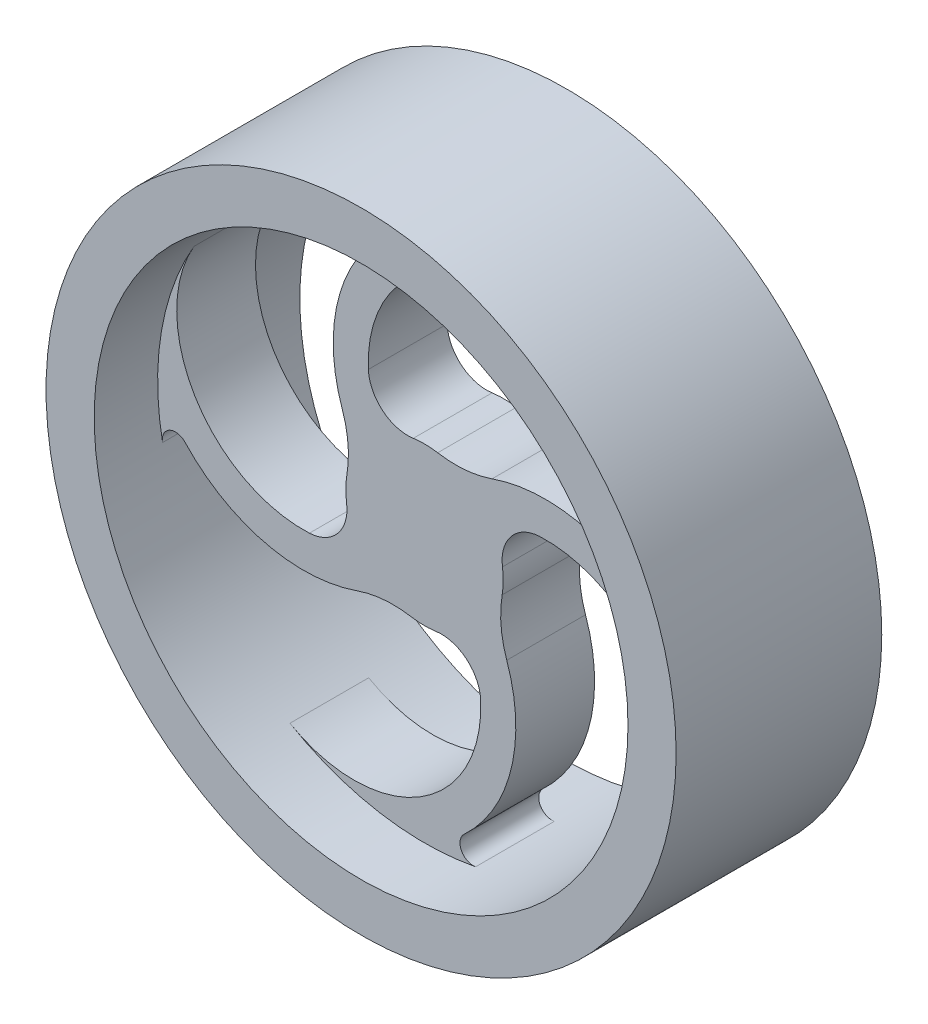
ISO-10303-21;
HEADER;
FILE_DESCRIPTION(('STEP AP214'),'2;1');
FILE_NAME('part.step','',(''),(''),'','','');
FILE_SCHEMA(('AUTOMOTIVE_DESIGN { 1 0 10303 214 1 1 1 1 }'));
ENDSEC;
DATA;
#1=APPLICATION_CONTEXT('core data for automotive mechanical design processes');
#2=APPLICATION_PROTOCOL_DEFINITION('international standard','automotive_design',2000,#1);
#3=PRODUCT_CONTEXT('',#1,'mechanical');
#4=PRODUCT('Part','Part','',(#3));
#5=PRODUCT_RELATED_PRODUCT_CATEGORY('part','',(#4));
#6=PRODUCT_DEFINITION_FORMATION('','',#4);
#7=PRODUCT_DEFINITION_CONTEXT('part definition',#1,'design');
#8=PRODUCT_DEFINITION('design','',#6,#7);
#9=PRODUCT_DEFINITION_SHAPE('','',#8);
#10=(LENGTH_UNIT() NAMED_UNIT(*) SI_UNIT(.MILLI.,.METRE.));
#11=(NAMED_UNIT(*) PLANE_ANGLE_UNIT() SI_UNIT($,.RADIAN.));
#12=(NAMED_UNIT(*) SI_UNIT($,.STERADIAN.) SOLID_ANGLE_UNIT());
#13=UNCERTAINTY_MEASURE_WITH_UNIT(LENGTH_MEASURE(1.E-05),#10,'distance_accuracy_value','');
#14=(GEOMETRIC_REPRESENTATION_CONTEXT(3) GLOBAL_UNCERTAINTY_ASSIGNED_CONTEXT((#13)) GLOBAL_UNIT_ASSIGNED_CONTEXT((#10,
#11,#12)) REPRESENTATION_CONTEXT('',''));
#15=CARTESIAN_POINT('',(0.,0.,0.));
#16=DIRECTION('',(0.,0.,1.));
#17=DIRECTION('',(1.,0.,0.));
#18=AXIS2_PLACEMENT_3D('',#15,#16,#17);
#19=CARTESIAN_POINT('',(16.134984535512,27.6344382970497,-18.));
#20=DIRECTION('',(0.,0.,1.));
#21=DIRECTION('',(1.,0.,0.));
#22=AXIS2_PLACEMENT_3D('',#19,#20,#21);
#23=CYLINDRICAL_SURFACE('',#22,29.0000014694584);
#24=CARTESIAN_POINT('',(16.134984535512,27.6344382970497,0.));
#25=DIRECTION('',(0.,0.,1.));
#26=DIRECTION('',(1.,0.,0.));
#27=AXIS2_PLACEMENT_3D('',#24,#25,#26);
#28=CIRCLE('',#27,29.0000014694584);
#29=CARTESIAN_POINT('',(30.7573156832135,52.678150422762,0.));
#30=VERTEX_POINT('',#29);
#31=CARTESIAN_POINT('',(-12.8350143326064,26.3156317116074,0.));
#32=VERTEX_POINT('',#31);
#33=EDGE_CURVE('E247',#30,#32,#28,.T.);
#34=ORIENTED_EDGE('',*,*,#33,.T.);
#35=DIRECTION('',(0.,0.,1.));
#36=VECTOR('',#35,1.);
#37=CARTESIAN_POINT('',(-12.8350143326064,26.3156317116074,-18.));
#38=LINE('',#37,#36);
#39=CARTESIAN_POINT('',(-12.8350143326064,26.3156317116074,-18.));
#40=VERTEX_POINT('',#39);
#41=EDGE_CURVE('E11',#40,#32,#38,.T.);
#42=ORIENTED_EDGE('',*,*,#41,.F.);
#43=CARTESIAN_POINT('',(16.134984535512,27.6344382970497,-18.));
#44=DIRECTION('',(0.,0.,1.));
#45=DIRECTION('',(1.,0.,0.));
#46=AXIS2_PLACEMENT_3D('',#43,#44,#45);
#47=CIRCLE('',#46,29.0000014694584);
#48=CARTESIAN_POINT('',(30.7573156832135,52.678150422762,-18.));
#49=VERTEX_POINT('',#48);
#50=EDGE_CURVE('E353',#49,#40,#47,.T.);
#51=ORIENTED_EDGE('',*,*,#50,.F.);
#52=DIRECTION('',(0.,0.,1.));
#53=VECTOR('',#52,1.);
#54=CARTESIAN_POINT('',(30.7573152957529,52.6781506489895,-18.));
#55=LINE('',#54,#53);
#56=EDGE_CURVE('E246',#49,#30,#55,.T.);
#57=ORIENTED_EDGE('',*,*,#56,.T.);
#58=EDGE_LOOP('',(#34,#42,#51,#57));
#59=FACE_BOUND('',#58,.T.);
#60=ADVANCED_FACE('F43',(#59),#23,.F.);
#61=CARTESIAN_POINT('',(-3.84432548427402,26.7249164932472,-18.));
#62=DIRECTION('',(0.,0.,1.));
#63=DIRECTION('',(1.,0.,0.));
#64=AXIS2_PLACEMENT_3D('',#61,#62,#63);
#65=CYLINDRICAL_SURFACE('',#64,9.00000000000062);
#66=CARTESIAN_POINT('',(-3.84432548427402,26.7249164932472,0.));
#67=DIRECTION('',(0.,0.,1.));
#68=DIRECTION('',(1.,0.,0.));
#69=AXIS2_PLACEMENT_3D('',#66,#67,#68);
#70=CIRCLE('',#69,9.00000000000062);
#71=CARTESIAN_POINT('',(-2.56288325265867,17.8166110535441,0.));
#72=VERTEX_POINT('',#71);
#73=EDGE_CURVE('E251',#32,#72,#70,.T.);
#74=ORIENTED_EDGE('',*,*,#73,.T.);
#75=DIRECTION('',(0.,0.,1.));
#76=VECTOR('',#75,1.);
#77=CARTESIAN_POINT('',(-2.56288325265867,17.8166110535441,-18.));
#78=LINE('',#77,#76);
#79=CARTESIAN_POINT('',(-2.56288325265867,17.8166110535441,-18.));
#80=VERTEX_POINT('',#79);
#81=EDGE_CURVE('E52',#80,#72,#78,.T.);
#82=ORIENTED_EDGE('',*,*,#81,.F.);
#83=CARTESIAN_POINT('',(-3.84432548427402,26.7249164932472,-18.));
#84=DIRECTION('',(0.,0.,1.));
#85=DIRECTION('',(1.,0.,0.));
#86=AXIS2_PLACEMENT_3D('',#83,#84,#85);
#87=CIRCLE('',#86,9.00000000000062);
#88=EDGE_CURVE('E150',#40,#80,#87,.T.);
#89=ORIENTED_EDGE('',*,*,#88,.F.);
#90=ORIENTED_EDGE('',*,*,#41,.T.);
#91=EDGE_LOOP('',(#74,#82,#89,#90));
#92=FACE_BOUND('',#91,.T.);
#93=ADVANCED_FACE('F437',(#92),#65,.F.);
#94=CARTESIAN_POINT('',(0.,0.,-18.));
#95=DIRECTION('',(0.,0.,1.));
#96=DIRECTION('',(1.,0.,0.));
#97=AXIS2_PLACEMENT_3D('',#94,#95,#96);
#98=CYLINDRICAL_SURFACE('',#97,18.0000000000008);
#99=CARTESIAN_POINT('',(0.,0.,0.));
#100=DIRECTION('',(0.,0.,1.));
#101=DIRECTION('',(1.,0.,0.));
#102=AXIS2_PLACEMENT_3D('',#99,#100,#101);
#103=CIRCLE('',#102,18.0000000000008);
#104=CARTESIAN_POINT('',(3.00763509896575,17.7469470927114,0.));
#105=VERTEX_POINT('',#104);
#106=EDGE_CURVE('E256',#105,#72,#103,.T.);
#107=ORIENTED_EDGE('',*,*,#106,.F.);
#108=DIRECTION('',(0.,0.,1.));
#109=VECTOR('',#108,1.);
#110=CARTESIAN_POINT('',(3.00763509896575,17.7469470927114,-18.));
#111=LINE('',#110,#109);
#112=CARTESIAN_POINT('',(3.00763509896575,17.7469470927114,-18.));
#113=VERTEX_POINT('',#112);
#114=EDGE_CURVE('E428',#113,#105,#111,.T.);
#115=ORIENTED_EDGE('',*,*,#114,.F.);
#116=CARTESIAN_POINT('',(0.,0.,-18.));
#117=DIRECTION('',(0.,0.,1.));
#118=DIRECTION('',(1.,0.,0.));
#119=AXIS2_PLACEMENT_3D('',#116,#117,#118);
#120=CIRCLE('',#119,18.0000000000008);
#121=EDGE_CURVE('E436',#113,#80,#120,.T.);
#122=ORIENTED_EDGE('',*,*,#121,.T.);
#123=ORIENTED_EDGE('',*,*,#81,.T.);
#124=EDGE_LOOP('',(#107,#115,#122,#123));
#125=FACE_BOUND('',#124,.T.);
#126=ADVANCED_FACE('F434',(#125),#98,.T.);
#127=CARTESIAN_POINT('',(7.18490606913064,42.3954847215827,-18.));
#128=DIRECTION('',(0.,0.,1.));
#129=DIRECTION('',(1.,0.,0.));
#130=AXIS2_PLACEMENT_3D('',#127,#128,#129);
#131=CYLINDRICAL_SURFACE('',#130,25.0000000000013);
#132=CARTESIAN_POINT('',(7.18490606913064,42.3954847215827,0.));
#133=DIRECTION('',(0.,0.,1.));
#134=DIRECTION('',(1.,0.,0.));
#135=AXIS2_PLACEMENT_3D('',#132,#133,#134);
#136=CIRCLE('',#135,25.0000000000013);
#137=CARTESIAN_POINT('',(15.4306840332518,18.7944858917348,0.));
#138=VERTEX_POINT('',#137);
#139=EDGE_CURVE('E260',#105,#138,#136,.T.);
#140=ORIENTED_EDGE('',*,*,#139,.T.);
#141=DIRECTION('',(0.,0.,1.));
#142=VECTOR('',#141,1.);
#143=CARTESIAN_POINT('',(15.4306840332518,18.7944858917348,-18.));
#144=LINE('',#143,#142);
#145=CARTESIAN_POINT('',(15.4306840332518,18.7944858917348,-18.));
#146=VERTEX_POINT('',#145);
#147=EDGE_CURVE('E425',#146,#138,#144,.T.);
#148=ORIENTED_EDGE('',*,*,#147,.F.);
#149=CARTESIAN_POINT('',(7.18490606913064,42.3954847215827,-18.));
#150=DIRECTION('',(0.,0.,1.));
#151=DIRECTION('',(1.,0.,0.));
#152=AXIS2_PLACEMENT_3D('',#149,#150,#151);
#153=CIRCLE('',#152,25.0000000000013);
#154=EDGE_CURVE('E450',#113,#146,#153,.T.);
#155=ORIENTED_EDGE('',*,*,#154,.F.);
#156=ORIENTED_EDGE('',*,*,#114,.T.);
#157=EDGE_LOOP('',(#140,#148,#155,#156));
#158=FACE_BOUND('',#157,.T.);
#159=ADVANCED_FACE('F447',(#158),#131,.F.);
#160=CARTESIAN_POINT('',(27.63443542015,-16.134992376437,-18.));
#161=DIRECTION('',(0.,0.,1.));
#162=DIRECTION('',(1.,0.,0.));
#163=AXIS2_PLACEMENT_3D('',#160,#161,#162);
#164=CYLINDRICAL_SURFACE('',#163,36.9999999999987);
#165=CARTESIAN_POINT('',(27.63443542015,-16.134992376437,0.));
#166=DIRECTION('',(0.,0.,1.));
#167=DIRECTION('',(1.,0.,0.));
#168=AXIS2_PLACEMENT_3D('',#165,#166,#167);
#169=CIRCLE('',#168,36.9999999999987);
#170=CARTESIAN_POINT('',(54.7303126593143,9.06051191778274,0.));
#171=VERTEX_POINT('',#170);
#172=EDGE_CURVE('E264',#171,#138,#169,.T.);
#173=ORIENTED_EDGE('',*,*,#172,.F.);
#174=DIRECTION('',(0.,0.,1.));
#175=VECTOR('',#174,1.);
#176=CARTESIAN_POINT('',(54.7303126593143,9.06051191778274,-18.));
#177=LINE('',#176,#175);
#178=CARTESIAN_POINT('',(54.7303126593143,9.06051191778274,-18.));
#179=VERTEX_POINT('',#178);
#180=EDGE_CURVE('E422',#179,#171,#177,.T.);
#181=ORIENTED_EDGE('',*,*,#180,.F.);
#182=CARTESIAN_POINT('',(27.63443542015,-16.134992376437,-18.));
#183=DIRECTION('',(0.,0.,1.));
#184=DIRECTION('',(1.,0.,0.));
#185=AXIS2_PLACEMENT_3D('',#182,#183,#184);
#186=CIRCLE('',#185,36.9999999999987);
#187=EDGE_CURVE('E453',#179,#146,#186,.T.);
#188=ORIENTED_EDGE('',*,*,#187,.T.);
#189=ORIENTED_EDGE('',*,*,#147,.T.);
#190=EDGE_LOOP('',(#173,#181,#188,#189));
#191=FACE_BOUND('',#190,.T.);
#192=ADVANCED_FACE('F593',(#191),#164,.T.);
#193=CARTESIAN_POINT('',(56.9272756787052,11.1033906443404,-18.));
#194=DIRECTION('',(0.,0.,1.));
#195=DIRECTION('',(1.,0.,0.));
#196=AXIS2_PLACEMENT_3D('',#193,#194,#195);
#197=CYLINDRICAL_SURFACE('',#196,2.99999999999882);
#198=CARTESIAN_POINT('',(56.9272756787052,11.1033906443404,0.));
#199=DIRECTION('',(0.,0.,1.));
#200=DIRECTION('',(1.,0.,0.));
#201=AXIS2_PLACEMENT_3D('',#198,#199,#200);
#202=CIRCLE('',#201,2.99999999999882);
#203=CARTESIAN_POINT('',(59.8717899379474,11.6777039535302,0.));
#204=VERTEX_POINT('',#203);
#205=EDGE_CURVE('E268',#171,#204,#202,.T.);
#206=ORIENTED_EDGE('',*,*,#205,.T.);
#207=DIRECTION('',(0.,0.,1.));
#208=VECTOR('',#207,1.);
#209=CARTESIAN_POINT('',(59.8717899379474,11.6777039535302,-18.));
#210=LINE('',#209,#208);
#211=CARTESIAN_POINT('',(59.8717899379474,11.6777039535301,-18.));
#212=VERTEX_POINT('',#211);
#213=EDGE_CURVE('E419',#212,#204,#210,.T.);
#214=ORIENTED_EDGE('',*,*,#213,.F.);
#215=CARTESIAN_POINT('',(56.9272756787052,11.1033906443404,-18.));
#216=DIRECTION('',(0.,0.,1.));
#217=DIRECTION('',(1.,0.,0.));
#218=AXIS2_PLACEMENT_3D('',#215,#216,#217);
#219=CIRCLE('',#218,2.99999999999882);
#220=EDGE_CURVE('E463',#179,#212,#219,.T.);
#221=ORIENTED_EDGE('',*,*,#220,.F.);
#222=ORIENTED_EDGE('',*,*,#180,.T.);
#223=EDGE_LOOP('',(#206,#214,#221,#222));
#224=FACE_BOUND('',#223,.T.);
#225=ADVANCED_FACE('F596',(#224),#197,.F.);
#226=CARTESIAN_POINT('',(27.63443542015,-16.134992376437,-18.));
#227=DIRECTION('',(0.,0.,1.));
#228=DIRECTION('',(1.,0.,0.));
#229=AXIS2_PLACEMENT_3D('',#226,#227,#228);
#230=CYLINDRICAL_SURFACE('',#229,29.0000000003419);
#231=CARTESIAN_POINT('',(27.63443542015,-16.134992376437,0.));
#232=DIRECTION('',(0.,0.,1.));
#233=DIRECTION('',(1.,0.,0.));
#234=AXIS2_PLACEMENT_3D('',#231,#232,#233);
#235=CIRCLE('',#234,29.0000000003419);
#236=CARTESIAN_POINT('',(52.6781425202238,-30.7573292179116,0.));
#237=VERTEX_POINT('',#236);
#238=CARTESIAN_POINT('',(26.315634878569,12.8350052961787,0.));
#239=VERTEX_POINT('',#238);
#240=EDGE_CURVE('E276',#237,#239,#235,.T.);
#241=ORIENTED_EDGE('',*,*,#240,.T.);
#242=DIRECTION('',(0.,0.,1.));
#243=VECTOR('',#242,1.);
#244=CARTESIAN_POINT('',(26.315634878569,12.8350052961787,-18.));
#245=LINE('',#244,#243);
#246=CARTESIAN_POINT('',(26.315634878569,12.8350052961787,-18.));
#247=VERTEX_POINT('',#246);
#248=EDGE_CURVE('E411',#247,#239,#245,.T.);
#249=ORIENTED_EDGE('',*,*,#248,.F.);
#250=CARTESIAN_POINT('',(27.63443542015,-16.134992376437,-18.));
#251=DIRECTION('',(0.,0.,1.));
#252=DIRECTION('',(1.,0.,0.));
#253=AXIS2_PLACEMENT_3D('',#250,#251,#252);
#254=CIRCLE('',#253,29.0000000003419);
#255=CARTESIAN_POINT('',(52.6781425202238,-30.7573292179116,-18.));
#256=VERTEX_POINT('',#255);
#257=EDGE_CURVE('E471',#256,#247,#254,.T.);
#258=ORIENTED_EDGE('',*,*,#257,.F.);
#259=DIRECTION('',(0.,0.,1.));
#260=VECTOR('',#259,1.);
#261=CARTESIAN_POINT('',(52.6781425202229,-30.757329217911,-18.));
#262=LINE('',#261,#260);
#263=EDGE_CURVE('E415',#256,#237,#262,.T.);
#264=ORIENTED_EDGE('',*,*,#263,.T.);
#265=EDGE_LOOP('',(#241,#249,#258,#264));
#266=FACE_BOUND('',#265,.T.);
#267=ADVANCED_FACE('F600',(#266),#230,.F.);
#268=CARTESIAN_POINT('',(26.7249178052616,3.84431636340755,-18.));
#269=DIRECTION('',(0.,0.,1.));
#270=DIRECTION('',(1.,0.,0.));
#271=AXIS2_PLACEMENT_3D('',#268,#269,#270);
#272=CYLINDRICAL_SURFACE('',#271,8.99999999999842);
#273=CARTESIAN_POINT('',(26.7249178052616,3.84431636340755,0.));
#274=DIRECTION('',(0.,0.,1.));
#275=DIRECTION('',(1.,0.,0.));
#276=AXIS2_PLACEMENT_3D('',#273,#274,#275);
#277=CIRCLE('',#276,8.99999999999842);
#278=CARTESIAN_POINT('',(17.8166117047979,2.56287872527853,0.));
#279=VERTEX_POINT('',#278);
#280=EDGE_CURVE('E279',#239,#279,#277,.T.);
#281=ORIENTED_EDGE('',*,*,#280,.T.);
#282=DIRECTION('',(0.,0.,1.));
#283=VECTOR('',#282,1.);
#284=CARTESIAN_POINT('',(17.8166117047979,2.56287872527853,-18.));
#285=LINE('',#284,#283);
#286=CARTESIAN_POINT('',(17.8166117047979,2.56287872527853,-18.));
#287=VERTEX_POINT('',#286);
#288=EDGE_CURVE('E408',#287,#279,#285,.T.);
#289=ORIENTED_EDGE('',*,*,#288,.F.);
#290=CARTESIAN_POINT('',(26.7249178052616,3.84431636340755,-18.));
#291=DIRECTION('',(0.,0.,1.));
#292=DIRECTION('',(1.,0.,0.));
#293=AXIS2_PLACEMENT_3D('',#290,#291,#292);
#294=CIRCLE('',#293,8.99999999999842);
#295=EDGE_CURVE('E474',#247,#287,#294,.T.);
#296=ORIENTED_EDGE('',*,*,#295,.F.);
#297=ORIENTED_EDGE('',*,*,#248,.T.);
#298=EDGE_LOOP('',(#281,#289,#296,#297));
#299=FACE_BOUND('',#298,.T.);
#300=ADVANCED_FACE('F604',(#299),#272,.F.);
#301=CARTESIAN_POINT('',(0.,0.,-18.));
#302=DIRECTION('',(0.,0.,1.));
#303=DIRECTION('',(1.,0.,0.));
#304=AXIS2_PLACEMENT_3D('',#301,#302,#303);
#305=CYLINDRICAL_SURFACE('',#304,18.0000000000008);
#306=CARTESIAN_POINT('',(0.,0.,0.));
#307=DIRECTION('',(0.,0.,1.));
#308=DIRECTION('',(1.,0.,0.));
#309=AXIS2_PLACEMENT_3D('',#306,#307,#308);
#310=CIRCLE('',#309,18.0000000000008);
#311=CARTESIAN_POINT('',(17.7469469927022,-3.00763568908295,0.));
#312=VERTEX_POINT('',#311);
#313=EDGE_CURVE('E283',#312,#279,#310,.T.);
#314=ORIENTED_EDGE('',*,*,#313,.F.);
#315=DIRECTION('',(0.,0.,1.));
#316=VECTOR('',#315,1.);
#317=CARTESIAN_POINT('',(17.7469469927022,-3.00763568908295,-18.));
#318=LINE('',#317,#316);
#319=CARTESIAN_POINT('',(17.7469469927022,-3.00763568908295,-18.));
#320=VERTEX_POINT('',#319);
#321=EDGE_CURVE('E405',#320,#312,#318,.T.);
#322=ORIENTED_EDGE('',*,*,#321,.F.);
#323=CARTESIAN_POINT('',(0.,0.,-18.));
#324=DIRECTION('',(0.,0.,1.));
#325=DIRECTION('',(1.,0.,0.));
#326=AXIS2_PLACEMENT_3D('',#323,#324,#325);
#327=CIRCLE('',#326,18.0000000000008);
#328=EDGE_CURVE('E477',#320,#287,#327,.T.);
#329=ORIENTED_EDGE('',*,*,#328,.T.);
#330=ORIENTED_EDGE('',*,*,#288,.T.);
#331=EDGE_LOOP('',(#314,#322,#329,#330));
#332=FACE_BOUND('',#331,.T.);
#333=ADVANCED_FACE('F608',(#332),#305,.T.);
#334=CARTESIAN_POINT('',(42.3954846214234,-7.18490666011555,-18.));
#335=DIRECTION('',(0.,0.,1.));
#336=DIRECTION('',(1.,0.,0.));
#337=AXIS2_PLACEMENT_3D('',#334,#335,#336);
#338=CYLINDRICAL_SURFACE('',#337,24.9999999999983);
#339=CARTESIAN_POINT('',(42.3954846214234,-7.18490666011555,0.));
#340=DIRECTION('',(0.,0.,1.));
#341=DIRECTION('',(1.,0.,0.));
#342=AXIS2_PLACEMENT_3D('',#339,#340,#341);
#343=CIRCLE('',#342,24.9999999999983);
#344=CARTESIAN_POINT('',(18.7944863497258,-15.4306862217604,0.));
#345=VERTEX_POINT('',#344);
#346=EDGE_CURVE('E287',#312,#345,#343,.T.);
#347=ORIENTED_EDGE('',*,*,#346,.T.);
#348=DIRECTION('',(0.,0.,1.));
#349=VECTOR('',#348,1.);
#350=CARTESIAN_POINT('',(18.7944863497258,-15.4306862217604,-18.));
#351=LINE('',#350,#349);
#352=CARTESIAN_POINT('',(18.7944863497258,-15.4306862217604,-18.));
#353=VERTEX_POINT('',#352);
#354=EDGE_CURVE('E402',#353,#345,#351,.T.);
#355=ORIENTED_EDGE('',*,*,#354,.F.);
#356=CARTESIAN_POINT('',(42.3954846214234,-7.18490666011555,-18.));
#357=DIRECTION('',(0.,0.,1.));
#358=DIRECTION('',(1.,0.,0.));
#359=AXIS2_PLACEMENT_3D('',#356,#357,#358);
#360=CIRCLE('',#359,24.9999999999983);
#361=EDGE_CURVE('E481',#320,#353,#360,.T.);
#362=ORIENTED_EDGE('',*,*,#361,.F.);
#363=ORIENTED_EDGE('',*,*,#321,.T.);
#364=EDGE_LOOP('',(#347,#355,#362,#363));
#365=FACE_BOUND('',#364,.T.);
#366=ADVANCED_FACE('F612',(#365),#338,.F.);
#367=CARTESIAN_POINT('',(-16.1349849997751,-27.634437844345,-18.));
#368=DIRECTION('',(0.,0.,1.));
#369=DIRECTION('',(1.,0.,0.));
#370=AXIS2_PLACEMENT_3D('',#367,#368,#369);
#371=CYLINDRICAL_SURFACE('',#370,36.9999935462333);
#372=CARTESIAN_POINT('',(-16.1349849997751,-27.634437844345,0.));
#373=DIRECTION('',(0.,0.,1.));
#374=DIRECTION('',(1.,0.,0.));
#375=AXIS2_PLACEMENT_3D('',#372,#373,#374);
#376=CIRCLE('',#375,36.9999935462333);
#377=CARTESIAN_POINT('',(9.0605127339962,-54.7303123710849,0.));
#378=VERTEX_POINT('',#377);
#379=EDGE_CURVE('E291',#378,#345,#376,.T.);
#380=ORIENTED_EDGE('',*,*,#379,.F.);
#381=DIRECTION('',(0.,0.,1.));
#382=VECTOR('',#381,1.);
#383=CARTESIAN_POINT('',(9.0605127339962,-54.7303123710849,-18.));
#384=LINE('',#383,#382);
#385=CARTESIAN_POINT('',(9.0605127339962,-54.7303123710849,-18.));
#386=VERTEX_POINT('',#385);
#387=EDGE_CURVE('E399',#386,#378,#384,.T.);
#388=ORIENTED_EDGE('',*,*,#387,.F.);
#389=CARTESIAN_POINT('',(-16.1349849997751,-27.634437844345,-18.));
#390=DIRECTION('',(0.,0.,1.));
#391=DIRECTION('',(1.,0.,0.));
#392=AXIS2_PLACEMENT_3D('',#389,#390,#391);
#393=CIRCLE('',#392,36.9999935462333);
#394=EDGE_CURVE('E484',#386,#353,#393,.T.);
#395=ORIENTED_EDGE('',*,*,#394,.T.);
#396=ORIENTED_EDGE('',*,*,#354,.T.);
#397=EDGE_LOOP('',(#380,#388,#395,#396));
#398=FACE_BOUND('',#397,.T.);
#399=ADVANCED_FACE('F616',(#398),#371,.T.);
#400=CARTESIAN_POINT('',(11.1033912849575,-56.9272755537578,-18.));
#401=DIRECTION('',(0.,0.,1.));
#402=DIRECTION('',(1.,0.,0.));
#403=AXIS2_PLACEMENT_3D('',#400,#401,#402);
#404=CYLINDRICAL_SURFACE('',#403,2.99999999999856);
#405=CARTESIAN_POINT('',(11.1033912849575,-56.9272755537578,0.));
#406=DIRECTION('',(0.,0.,1.));
#407=DIRECTION('',(1.,0.,0.));
#408=AXIS2_PLACEMENT_3D('',#405,#406,#407);
#409=CIRCLE('',#408,2.99999999999856);
#410=CARTESIAN_POINT('',(11.6777046272832,-59.8717898065367,0.));
#411=VERTEX_POINT('',#410);
#412=EDGE_CURVE('E295',#378,#411,#409,.T.);
#413=ORIENTED_EDGE('',*,*,#412,.T.);
#414=DIRECTION('',(0.,0.,1.));
#415=VECTOR('',#414,1.);
#416=CARTESIAN_POINT('',(11.6777046272832,-59.8717898065367,-18.));
#417=LINE('',#416,#415);
#418=CARTESIAN_POINT('',(11.6777046272826,-59.8717898065368,-18.));
#419=VERTEX_POINT('',#418);
#420=EDGE_CURVE('E396',#419,#411,#417,.T.);
#421=ORIENTED_EDGE('',*,*,#420,.F.);
#422=CARTESIAN_POINT('',(11.1033912849575,-56.9272755537578,-18.));
#423=DIRECTION('',(0.,0.,1.));
#424=DIRECTION('',(1.,0.,0.));
#425=AXIS2_PLACEMENT_3D('',#422,#423,#424);
#426=CIRCLE('',#425,2.99999999999856);
#427=EDGE_CURVE('E488',#386,#419,#426,.T.);
#428=ORIENTED_EDGE('',*,*,#427,.F.);
#429=ORIENTED_EDGE('',*,*,#387,.T.);
#430=EDGE_LOOP('',(#413,#421,#428,#429));
#431=FACE_BOUND('',#430,.T.);
#432=ADVANCED_FACE('F620',(#431),#404,.F.);
#433=CARTESIAN_POINT('',(-16.1349849997751,-27.634437844345,-18.));
#434=DIRECTION('',(0.,0.,1.));
#435=DIRECTION('',(1.,0.,0.));
#436=AXIS2_PLACEMENT_3D('',#433,#434,#435);
#437=CYLINDRICAL_SURFACE('',#436,29.0000016263136);
#438=CARTESIAN_POINT('',(-16.1349849997751,-27.634437844345,0.));
#439=DIRECTION('',(0.,0.,1.));
#440=DIRECTION('',(1.,0.,0.));
#441=AXIS2_PLACEMENT_3D('',#438,#439,#440);
#442=CIRCLE('',#441,29.0000016263136);
#443=CARTESIAN_POINT('',(-30.7573167189789,-52.6781498180074,0.));
#444=VERTEX_POINT('',#443);
#445=CARTESIAN_POINT('',(12.8350140580935,-26.3156319779325,0.));
#446=VERTEX_POINT('',#445);
#447=EDGE_CURVE('E303',#444,#446,#442,.T.);
#448=ORIENTED_EDGE('',*,*,#447,.T.);
#449=DIRECTION('',(0.,0.,1.));
#450=VECTOR('',#449,1.);
#451=CARTESIAN_POINT('',(12.8350140580935,-26.3156319779325,-18.));
#452=LINE('',#451,#450);
#453=CARTESIAN_POINT('',(12.8350140580935,-26.3156319779325,-18.));
#454=VERTEX_POINT('',#453);
#455=EDGE_CURVE('E388',#454,#446,#452,.T.);
#456=ORIENTED_EDGE('',*,*,#455,.F.);
#457=CARTESIAN_POINT('',(-16.1349849997751,-27.634437844345,-18.));
#458=DIRECTION('',(0.,0.,1.));
#459=DIRECTION('',(1.,0.,0.));
#460=AXIS2_PLACEMENT_3D('',#457,#458,#459);
#461=CIRCLE('',#460,29.0000016263136);
#462=CARTESIAN_POINT('',(-30.7573167189789,-52.6781498180074,-18.));
#463=VERTEX_POINT('',#462);
#464=EDGE_CURVE('E496',#463,#454,#461,.T.);
#465=ORIENTED_EDGE('',*,*,#464,.F.);
#466=DIRECTION('',(0.,0.,1.));
#467=VECTOR('',#466,1.);
#468=CARTESIAN_POINT('',(-30.7573167189783,-52.6781498180063,-18.));
#469=LINE('',#468,#467);
#470=EDGE_CURVE('E392',#463,#444,#469,.T.);
#471=ORIENTED_EDGE('',*,*,#470,.T.);
#472=EDGE_LOOP('',(#448,#456,#465,#471));
#473=FACE_BOUND('',#472,.T.);
#474=ADVANCED_FACE('F624',(#473),#437,.F.);
#475=CARTESIAN_POINT('',(3.84432519950451,-26.7249165342103,-18.));
#476=DIRECTION('',(0.,0.,1.));
#477=DIRECTION('',(1.,0.,0.));
#478=AXIS2_PLACEMENT_3D('',#475,#476,#477);
#479=CYLINDRICAL_SURFACE('',#478,9.0000000000004);
#480=CARTESIAN_POINT('',(3.84432519950451,-26.7249165342103,0.));
#481=DIRECTION('',(0.,0.,1.));
#482=DIRECTION('',(1.,0.,0.));
#483=AXIS2_PLACEMENT_3D('',#480,#481,#482);
#484=CIRCLE('',#483,9.0000000000004);
#485=CARTESIAN_POINT('',(2.56288204912299,-17.8166112266702,0.));
#486=VERTEX_POINT('',#485);
#487=EDGE_CURVE('E306',#446,#486,#484,.T.);
#488=ORIENTED_EDGE('',*,*,#487,.T.);
#489=DIRECTION('',(0.,0.,1.));
#490=VECTOR('',#489,1.);
#491=CARTESIAN_POINT('',(2.56288204912299,-17.8166112266702,-18.));
#492=LINE('',#491,#490);
#493=CARTESIAN_POINT('',(2.56288204912299,-17.8166112266702,-18.));
#494=VERTEX_POINT('',#493);
#495=EDGE_CURVE('E385',#494,#486,#492,.T.);
#496=ORIENTED_EDGE('',*,*,#495,.F.);
#497=CARTESIAN_POINT('',(3.84432519950451,-26.7249165342103,-18.));
#498=DIRECTION('',(0.,0.,1.));
#499=DIRECTION('',(1.,0.,0.));
#500=AXIS2_PLACEMENT_3D('',#497,#498,#499);
#501=CIRCLE('',#500,9.0000000000004);
#502=EDGE_CURVE('E499',#454,#494,#501,.T.);
#503=ORIENTED_EDGE('',*,*,#502,.F.);
#504=ORIENTED_EDGE('',*,*,#455,.T.);
#505=EDGE_LOOP('',(#488,#496,#503,#504));
#506=FACE_BOUND('',#505,.T.);
#507=ADVANCED_FACE('F628',(#506),#479,.F.);
#508=CARTESIAN_POINT('',(0.,0.,-18.));
#509=DIRECTION('',(0.,0.,1.));
#510=DIRECTION('',(1.,0.,0.));
#511=AXIS2_PLACEMENT_3D('',#508,#509,#510);
#512=CYLINDRICAL_SURFACE('',#511,18.0000000000008);
#513=CARTESIAN_POINT('',(0.,0.,0.));
#514=DIRECTION('',(0.,0.,1.));
#515=DIRECTION('',(1.,0.,0.));
#516=AXIS2_PLACEMENT_3D('',#513,#514,#515);
#517=CIRCLE('',#516,18.0000000000008);
#518=CARTESIAN_POINT('',(-3.00763494607107,-17.746947118623,0.));
#519=VERTEX_POINT('',#518);
#520=EDGE_CURVE('E310',#519,#486,#517,.T.);
#521=ORIENTED_EDGE('',*,*,#520,.F.);
#522=DIRECTION('',(0.,0.,1.));
#523=VECTOR('',#522,1.);
#524=CARTESIAN_POINT('',(-3.00763494607107,-17.746947118623,-18.));
#525=LINE('',#524,#523);
#526=CARTESIAN_POINT('',(-3.00763494607107,-17.746947118623,-18.));
#527=VERTEX_POINT('',#526);
#528=EDGE_CURVE('E382',#527,#519,#525,.T.);
#529=ORIENTED_EDGE('',*,*,#528,.F.);
#530=CARTESIAN_POINT('',(0.,0.,-18.));
#531=DIRECTION('',(0.,0.,1.));
#532=DIRECTION('',(1.,0.,0.));
#533=AXIS2_PLACEMENT_3D('',#530,#531,#532);
#534=CIRCLE('',#533,18.0000000000008);
#535=EDGE_CURVE('E502',#527,#494,#534,.T.);
#536=ORIENTED_EDGE('',*,*,#535,.T.);
#537=ORIENTED_EDGE('',*,*,#495,.T.);
#538=EDGE_LOOP('',(#521,#529,#536,#537));
#539=FACE_BOUND('',#538,.T.);
#540=ADVANCED_FACE('F632',(#539),#512,.T.);
#541=CARTESIAN_POINT('',(-7.18490591710366,-42.3954847473456,-18.));
#542=DIRECTION('',(0.,0.,1.));
#543=DIRECTION('',(1.,0.,0.));
#544=AXIS2_PLACEMENT_3D('',#541,#542,#543);
#545=CYLINDRICAL_SURFACE('',#544,24.9999999999998);
#546=CARTESIAN_POINT('',(-7.18490591710366,-42.3954847473456,0.));
#547=DIRECTION('',(0.,0.,1.));
#548=DIRECTION('',(1.,0.,0.));
#549=AXIS2_PLACEMENT_3D('',#546,#547,#548);
#550=CIRCLE('',#549,24.9999999999998);
#551=CARTESIAN_POINT('',(-15.4306855256056,-18.7944864920175,0.));
#552=VERTEX_POINT('',#551);
#553=EDGE_CURVE('E314',#519,#552,#550,.T.);
#554=ORIENTED_EDGE('',*,*,#553,.T.);
#555=DIRECTION('',(0.,0.,1.));
#556=VECTOR('',#555,1.);
#557=CARTESIAN_POINT('',(-15.4306855256056,-18.7944864920175,-18.));
#558=LINE('',#557,#556);
#559=CARTESIAN_POINT('',(-15.4306855256056,-18.7944864920175,-18.));
#560=VERTEX_POINT('',#559);
#561=EDGE_CURVE('E379',#560,#552,#558,.T.);
#562=ORIENTED_EDGE('',*,*,#561,.F.);
#563=CARTESIAN_POINT('',(-7.18490591710366,-42.3954847473456,-18.));
#564=DIRECTION('',(0.,0.,1.));
#565=DIRECTION('',(1.,0.,0.));
#566=AXIS2_PLACEMENT_3D('',#563,#564,#565);
#567=CIRCLE('',#566,24.9999999999998);
#568=EDGE_CURVE('E506',#527,#560,#567,.T.);
#569=ORIENTED_EDGE('',*,*,#568,.F.);
#570=ORIENTED_EDGE('',*,*,#528,.T.);
#571=EDGE_LOOP('',(#554,#562,#569,#570));
#572=FACE_BOUND('',#571,.T.);
#573=ADVANCED_FACE('F636',(#572),#545,.F.);
#574=CARTESIAN_POINT('',(-27.634437217535,16.1349848332547,-18.));
#575=DIRECTION('',(0.,0.,1.));
#576=DIRECTION('',(1.,0.,0.));
#577=AXIS2_PLACEMENT_3D('',#574,#575,#576);
#578=CYLINDRICAL_SURFACE('',#577,36.999993546233);
#579=CARTESIAN_POINT('',(-27.634437217535,16.1349848332547,0.));
#580=DIRECTION('',(0.,0.,1.));
#581=DIRECTION('',(1.,0.,0.));
#582=AXIS2_PLACEMENT_3D('',#579,#580,#581);
#583=CIRCLE('',#582,36.999993546233);
#584=CARTESIAN_POINT('',(-54.7303124399533,-9.06051215236601,0.));
#585=VERTEX_POINT('',#584);
#586=EDGE_CURVE('E318',#585,#552,#583,.T.);
#587=ORIENTED_EDGE('',*,*,#586,.F.);
#588=DIRECTION('',(0.,0.,1.));
#589=VECTOR('',#588,1.);
#590=CARTESIAN_POINT('',(-54.7303124399533,-9.06051215236601,-18.));
#591=LINE('',#590,#589);
#592=CARTESIAN_POINT('',(-54.7303124399533,-9.06051215236601,-18.));
#593=VERTEX_POINT('',#592);
#594=EDGE_CURVE('E376',#593,#585,#591,.T.);
#595=ORIENTED_EDGE('',*,*,#594,.F.);
#596=CARTESIAN_POINT('',(-27.634437217535,16.1349848332547,-18.));
#597=DIRECTION('',(0.,0.,1.));
#598=DIRECTION('',(1.,0.,0.));
#599=AXIS2_PLACEMENT_3D('',#596,#597,#598);
#600=CIRCLE('',#599,36.999993546233);
#601=EDGE_CURVE('E509',#593,#560,#600,.T.);
#602=ORIENTED_EDGE('',*,*,#601,.T.);
#603=ORIENTED_EDGE('',*,*,#561,.T.);
#604=EDGE_LOOP('',(#587,#595,#602,#603));
#605=FACE_BOUND('',#604,.T.);
#606=ADVANCED_FACE('F640',(#605),#578,.T.);
#607=CARTESIAN_POINT('',(-56.9272756790319,-11.1033906426658,-18.));
#608=DIRECTION('',(0.,0.,1.));
#609=DIRECTION('',(1.,0.,0.));
#610=AXIS2_PLACEMENT_3D('',#607,#608,#609);
#611=CYLINDRICAL_SURFACE('',#610,2.99999999999874);
#612=CARTESIAN_POINT('',(-56.9272756790319,-11.1033906426658,0.));
#613=DIRECTION('',(0.,0.,1.));
#614=DIRECTION('',(1.,0.,0.));
#615=AXIS2_PLACEMENT_3D('',#612,#613,#614);
#616=CIRCLE('',#615,2.99999999999874);
#617=CARTESIAN_POINT('',(-59.8717899382909,-11.677703951769,0.));
#618=VERTEX_POINT('',#617);
#619=EDGE_CURVE('E322',#585,#618,#616,.T.);
#620=ORIENTED_EDGE('',*,*,#619,.T.);
#621=DIRECTION('',(0.,0.,1.));
#622=VECTOR('',#621,1.);
#623=CARTESIAN_POINT('',(-59.8717899382909,-11.677703951769,-18.));
#624=LINE('',#623,#622);
#625=CARTESIAN_POINT('',(-59.8717899382909,-11.677703951769,-18.));
#626=VERTEX_POINT('',#625);
#627=EDGE_CURVE('E373',#626,#618,#624,.T.);
#628=ORIENTED_EDGE('',*,*,#627,.F.);
#629=CARTESIAN_POINT('',(-56.9272756790319,-11.1033906426658,-18.));
#630=DIRECTION('',(0.,0.,1.));
#631=DIRECTION('',(1.,0.,0.));
#632=AXIS2_PLACEMENT_3D('',#629,#630,#631);
#633=CIRCLE('',#632,2.99999999999874);
#634=EDGE_CURVE('E513',#593,#626,#633,.T.);
#635=ORIENTED_EDGE('',*,*,#634,.F.);
#636=ORIENTED_EDGE('',*,*,#594,.T.);
#637=EDGE_LOOP('',(#620,#628,#635,#636));
#638=FACE_BOUND('',#637,.T.);
#639=ADVANCED_FACE('F644',(#638),#611,.F.);
#640=CARTESIAN_POINT('',(-27.634437217535,16.1349848332547,-18.));
#641=DIRECTION('',(0.,0.,1.));
#642=DIRECTION('',(1.,0.,0.));
#643=AXIS2_PLACEMENT_3D('',#640,#641,#642);
#644=CYLINDRICAL_SURFACE('',#643,29.0000022515743);
#645=CARTESIAN_POINT('',(-27.634437217535,16.1349848332547,0.));
#646=DIRECTION('',(0.,0.,1.));
#647=DIRECTION('',(1.,0.,0.));
#648=AXIS2_PLACEMENT_3D('',#645,#646,#647);
#649=CIRCLE('',#648,29.0000022515743);
#650=CARTESIAN_POINT('',(-52.6781496524502,30.7573170025289,0.));
#651=VERTEX_POINT('',#650);
#652=CARTESIAN_POINT('',(-26.3156321026672,-12.8350148847348,0.));
#653=VERTEX_POINT('',#652);
#654=EDGE_CURVE('E330',#651,#653,#649,.T.);
#655=ORIENTED_EDGE('',*,*,#654,.T.);
#656=DIRECTION('',(0.,0.,1.));
#657=VECTOR('',#656,1.);
#658=CARTESIAN_POINT('',(-26.3156321026672,-12.8350148847348,-18.));
#659=LINE('',#658,#657);
#660=CARTESIAN_POINT('',(-26.3156321026672,-12.8350148847348,-18.));
#661=VERTEX_POINT('',#660);
#662=EDGE_CURVE('E365',#661,#653,#659,.T.);
#663=ORIENTED_EDGE('',*,*,#662,.F.);
#664=CARTESIAN_POINT('',(-27.634437217535,16.1349848332547,-18.));
#665=DIRECTION('',(0.,0.,1.));
#666=DIRECTION('',(1.,0.,0.));
#667=AXIS2_PLACEMENT_3D('',#664,#665,#666);
#668=CIRCLE('',#667,29.0000022515743);
#669=CARTESIAN_POINT('',(-52.6781496524502,30.7573170025289,-18.));
#670=VERTEX_POINT('',#669);
#671=EDGE_CURVE('E233',#670,#661,#668,.T.);
#672=ORIENTED_EDGE('',*,*,#671,.F.);
#673=DIRECTION('',(0.,0.,1.));
#674=VECTOR('',#673,1.);
#675=CARTESIAN_POINT('',(-52.6781496524502,30.7573170025289,-18.));
#676=LINE('',#675,#674);
#677=EDGE_CURVE('E369',#670,#651,#676,.T.);
#678=ORIENTED_EDGE('',*,*,#677,.T.);
#679=EDGE_LOOP('',(#655,#663,#672,#678));
#680=FACE_BOUND('',#679,.T.);
#681=ADVANCED_FACE('F526',(#680),#644,.F.);
#682=CARTESIAN_POINT('',(-26.7249164168836,-3.84432601512492,-18.));
#683=DIRECTION('',(0.,0.,1.));
#684=DIRECTION('',(1.,0.,0.));
#685=AXIS2_PLACEMENT_3D('',#682,#683,#684);
#686=CYLINDRICAL_SURFACE('',#685,8.99999999999948);
#687=CARTESIAN_POINT('',(-26.7249164168836,-3.84432601512492,0.));
#688=DIRECTION('',(0.,0.,1.));
#689=DIRECTION('',(1.,0.,0.));
#690=AXIS2_PLACEMENT_3D('',#687,#688,#689);
#691=CIRCLE('',#690,8.99999999999948);
#692=CARTESIAN_POINT('',(-17.8166113271796,-2.5628813504027,0.));
#693=VERTEX_POINT('',#692);
#694=EDGE_CURVE('E333',#653,#693,#691,.T.);
#695=ORIENTED_EDGE('',*,*,#694,.T.);
#696=DIRECTION('',(0.,0.,1.));
#697=VECTOR('',#696,1.);
#698=CARTESIAN_POINT('',(-17.8166113271796,-2.5628813504027,-18.));
#699=LINE('',#698,#697);
#700=CARTESIAN_POINT('',(-17.8166113271796,-2.5628813504027,-18.));
#701=VERTEX_POINT('',#700);
#702=EDGE_CURVE('E215',#701,#693,#699,.T.);
#703=ORIENTED_EDGE('',*,*,#702,.F.);
#704=CARTESIAN_POINT('',(-26.7249164168836,-3.84432601512492,-18.));
#705=DIRECTION('',(0.,0.,1.));
#706=DIRECTION('',(1.,0.,0.));
#707=AXIS2_PLACEMENT_3D('',#704,#705,#706);
#708=CIRCLE('',#707,8.99999999999948);
#709=EDGE_CURVE('E228',#661,#701,#708,.T.);
#710=ORIENTED_EDGE('',*,*,#709,.F.);
#711=ORIENTED_EDGE('',*,*,#662,.T.);
#712=EDGE_LOOP('',(#695,#703,#710,#711));
#713=FACE_BOUND('',#712,.T.);
#714=ADVANCED_FACE('F530',(#713),#686,.F.);
#715=CARTESIAN_POINT('',(0.,0.,-18.));
#716=DIRECTION('',(0.,0.,1.));
#717=DIRECTION('',(1.,0.,0.));
#718=AXIS2_PLACEMENT_3D('',#715,#716,#717);
#719=CYLINDRICAL_SURFACE('',#718,18.0000000000008);
#720=CARTESIAN_POINT('',(0.,0.,0.));
#721=DIRECTION('',(0.,0.,1.));
#722=DIRECTION('',(1.,0.,0.));
#723=AXIS2_PLACEMENT_3D('',#720,#721,#722);
#724=CIRCLE('',#723,18.0000000000008);
#725=CARTESIAN_POINT('',(-17.7469470926813,3.00763509914331,0.));
#726=VERTEX_POINT('',#725);
#727=EDGE_CURVE('E210',#726,#693,#724,.T.);
#728=ORIENTED_EDGE('',*,*,#727,.F.);
#729=DIRECTION('',(0.,0.,1.));
#730=VECTOR('',#729,1.);
#731=CARTESIAN_POINT('',(-17.7469470926813,3.00763509914331,-18.));
#732=LINE('',#731,#730);
#733=CARTESIAN_POINT('',(-17.7469470926813,3.00763509914331,-18.));
#734=VERTEX_POINT('',#733);
#735=EDGE_CURVE('E204',#734,#726,#732,.T.);
#736=ORIENTED_EDGE('',*,*,#735,.F.);
#737=CARTESIAN_POINT('',(0.,0.,-18.));
#738=DIRECTION('',(0.,0.,1.));
#739=DIRECTION('',(1.,0.,0.));
#740=AXIS2_PLACEMENT_3D('',#737,#738,#739);
#741=CIRCLE('',#740,18.0000000000008);
#742=EDGE_CURVE('E208',#734,#701,#741,.T.);
#743=ORIENTED_EDGE('',*,*,#742,.T.);
#744=ORIENTED_EDGE('',*,*,#702,.T.);
#745=EDGE_LOOP('',(#728,#736,#743,#744));
#746=FACE_BOUND('',#745,.T.);
#747=ADVANCED_FACE('F206',(#746),#719,.T.);
#748=CARTESIAN_POINT('',(-42.3954847214037,7.18490607017591,-18.));
#749=DIRECTION('',(0.,0.,1.));
#750=DIRECTION('',(1.,0.,0.));
#751=AXIS2_PLACEMENT_3D('',#748,#749,#750);
#752=CYLINDRICAL_SURFACE('',#751,24.9999999999996);
#753=CARTESIAN_POINT('',(-42.3954847214037,7.18490607017591,0.));
#754=DIRECTION('',(0.,0.,1.));
#755=DIRECTION('',(1.,0.,0.));
#756=AXIS2_PLACEMENT_3D('',#753,#754,#755);
#757=CIRCLE('',#756,24.9999999999996);
#758=CARTESIAN_POINT('',(-18.7944865965932,15.4306860522435,0.));
#759=VERTEX_POINT('',#758);
#760=EDGE_CURVE('E339',#726,#759,#757,.T.);
#761=ORIENTED_EDGE('',*,*,#760,.T.);
#762=DIRECTION('',(0.,0.,1.));
#763=VECTOR('',#762,1.);
#764=CARTESIAN_POINT('',(-18.7944865965932,15.4306860522435,-18.));
#765=LINE('',#764,#763);
#766=CARTESIAN_POINT('',(-18.7944865965932,15.4306860522435,-18.));
#767=VERTEX_POINT('',#766);
#768=EDGE_CURVE('E216',#767,#759,#765,.T.);
#769=ORIENTED_EDGE('',*,*,#768,.F.);
#770=CARTESIAN_POINT('',(-42.3954847214037,7.18490607017591,-18.));
#771=DIRECTION('',(0.,0.,1.));
#772=DIRECTION('',(1.,0.,0.));
#773=AXIS2_PLACEMENT_3D('',#770,#771,#772);
#774=CIRCLE('',#773,24.9999999999996);
#775=EDGE_CURVE('E219',#734,#767,#774,.T.);
#776=ORIENTED_EDGE('',*,*,#775,.F.);
#777=ORIENTED_EDGE('',*,*,#735,.T.);
#778=EDGE_LOOP('',(#761,#769,#776,#777));
#779=FACE_BOUND('',#778,.T.);
#780=ADVANCED_FACE('F220',(#779),#752,.F.);
#781=CARTESIAN_POINT('',(16.134984535512,27.6344382970497,-18.));
#782=DIRECTION('',(0.,0.,1.));
#783=DIRECTION('',(1.,0.,0.));
#784=AXIS2_PLACEMENT_3D('',#781,#782,#783);
#785=CYLINDRICAL_SURFACE('',#784,36.9999935462317);
#786=CARTESIAN_POINT('',(16.134984535512,27.6344382970497,0.));
#787=DIRECTION('',(0.,0.,1.));
#788=DIRECTION('',(1.,0.,0.));
#789=AXIS2_PLACEMENT_3D('',#786,#787,#788);
#790=CIRCLE('',#789,36.9999935462317);
#791=CARTESIAN_POINT('',(-9.06051388212238,54.7303121878871,0.));
#792=VERTEX_POINT('',#791);
#793=EDGE_CURVE('E342',#792,#759,#790,.T.);
#794=ORIENTED_EDGE('',*,*,#793,.F.);
#795=DIRECTION('',(0.,0.,1.));
#796=VECTOR('',#795,1.);
#797=CARTESIAN_POINT('',(-9.06051388212238,54.7303121878871,-18.));
#798=LINE('',#797,#796);
#799=CARTESIAN_POINT('',(-9.06051388212238,54.7303121878871,-18.));
#800=VERTEX_POINT('',#799);
#801=EDGE_CURVE('E60',#800,#792,#798,.T.);
#802=ORIENTED_EDGE('',*,*,#801,.F.);
#803=CARTESIAN_POINT('',(16.134984535512,27.6344382970497,-18.));
#804=DIRECTION('',(0.,0.,1.));
#805=DIRECTION('',(1.,0.,0.));
#806=AXIS2_PLACEMENT_3D('',#803,#804,#805);
#807=CIRCLE('',#806,36.9999935462317);
#808=EDGE_CURVE('E224',#800,#767,#807,.T.);
#809=ORIENTED_EDGE('',*,*,#808,.T.);
#810=ORIENTED_EDGE('',*,*,#768,.T.);
#811=EDGE_LOOP('',(#794,#802,#809,#810));
#812=FACE_BOUND('',#811,.T.);
#813=ADVANCED_FACE('F531',(#812),#785,.T.);
#814=CARTESIAN_POINT('',(-11.1033924885333,56.9272753190017,-18.));
#815=DIRECTION('',(0.,0.,1.));
#816=DIRECTION('',(1.,0.,0.));
#817=AXIS2_PLACEMENT_3D('',#814,#815,#816);
#818=CYLINDRICAL_SURFACE('',#817,3.00000000000136);
#819=CARTESIAN_POINT('',(-11.1033924885333,56.9272753190017,0.));
#820=DIRECTION('',(0.,0.,1.));
#821=DIRECTION('',(1.,0.,0.));
#822=AXIS2_PLACEMENT_3D('',#819,#820,#821);
#823=CIRCLE('',#822,3.00000000000136);
#824=CARTESIAN_POINT('',(-11.6777058931129,59.8717895596411,0.));
#825=VERTEX_POINT('',#824);
#826=EDGE_CURVE('E346',#792,#825,#823,.T.);
#827=ORIENTED_EDGE('',*,*,#826,.T.);
#828=DIRECTION('',(0.,0.,1.));
#829=VECTOR('',#828,1.);
#830=CARTESIAN_POINT('',(-11.6777058931129,59.8717895596411,-18.));
#831=LINE('',#830,#829);
#832=CARTESIAN_POINT('',(-11.6777058931128,59.8717895596411,-18.));
#833=VERTEX_POINT('',#832);
#834=EDGE_CURVE('E143',#833,#825,#831,.T.);
#835=ORIENTED_EDGE('',*,*,#834,.F.);
#836=CARTESIAN_POINT('',(-11.1033924885333,56.9272753190017,-18.));
#837=DIRECTION('',(0.,0.,1.));
#838=DIRECTION('',(1.,0.,0.));
#839=AXIS2_PLACEMENT_3D('',#836,#837,#838);
#840=CIRCLE('',#839,3.00000000000136);
#841=EDGE_CURVE('E239',#800,#833,#840,.T.);
#842=ORIENTED_EDGE('',*,*,#841,.F.);
#843=ORIENTED_EDGE('',*,*,#801,.T.);
#844=EDGE_LOOP('',(#827,#835,#842,#843));
#845=FACE_BOUND('',#844,.T.);
#846=ADVANCED_FACE('F537',(#845),#818,.F.);
#847=CARTESIAN_POINT('',(6.14532952561901,27.1796773951484,-18.));
#848=DIRECTION('',(0.,0.,1.));
#849=DIRECTION('',(1.,0.,0.));
#850=AXIS2_PLACEMENT_3D('',#847,#848,#849);
#851=PLANE('',#850);
#852=ORIENTED_EDGE('',*,*,#50,.T.);
#853=ORIENTED_EDGE('',*,*,#88,.T.);
#854=ORIENTED_EDGE('',*,*,#121,.F.);
#855=ORIENTED_EDGE('',*,*,#154,.T.);
#856=ORIENTED_EDGE('',*,*,#187,.F.);
#857=ORIENTED_EDGE('',*,*,#220,.T.);
#858=CARTESIAN_POINT('',(0.,0.,-18.));
#859=DIRECTION('',(0.,0.,1.));
#860=DIRECTION('',(1.,0.,0.));
#861=AXIS2_PLACEMENT_3D('',#858,#859,#860);
#862=CIRCLE('',#861,60.999999999999);
#863=EDGE_CURVE('E467',#256,#212,#862,.T.);
#864=ORIENTED_EDGE('',*,*,#863,.F.);
#865=ORIENTED_EDGE('',*,*,#257,.T.);
#866=ORIENTED_EDGE('',*,*,#295,.T.);
#867=ORIENTED_EDGE('',*,*,#328,.F.);
#868=ORIENTED_EDGE('',*,*,#361,.T.);
#869=ORIENTED_EDGE('',*,*,#394,.F.);
#870=ORIENTED_EDGE('',*,*,#427,.T.);
#871=CARTESIAN_POINT('',(0.,0.,-18.));
#872=DIRECTION('',(0.,0.,1.));
#873=DIRECTION('',(1.,0.,0.));
#874=AXIS2_PLACEMENT_3D('',#871,#872,#873);
#875=CIRCLE('',#874,60.9999999999988);
#876=EDGE_CURVE('E492',#463,#419,#875,.T.);
#877=ORIENTED_EDGE('',*,*,#876,.F.);
#878=ORIENTED_EDGE('',*,*,#464,.T.);
#879=ORIENTED_EDGE('',*,*,#502,.T.);
#880=ORIENTED_EDGE('',*,*,#535,.F.);
#881=ORIENTED_EDGE('',*,*,#568,.T.);
#882=ORIENTED_EDGE('',*,*,#601,.F.);
#883=ORIENTED_EDGE('',*,*,#634,.T.);
#884=CARTESIAN_POINT('',(0.,0.,-18.));
#885=DIRECTION('',(0.,0.,1.));
#886=DIRECTION('',(1.,0.,0.));
#887=AXIS2_PLACEMENT_3D('',#884,#885,#886);
#888=CIRCLE('',#887,60.9999999999999);
#889=EDGE_CURVE('E517',#670,#626,#888,.T.);
#890=ORIENTED_EDGE('',*,*,#889,.F.);
#891=ORIENTED_EDGE('',*,*,#671,.T.);
#892=ORIENTED_EDGE('',*,*,#709,.T.);
#893=ORIENTED_EDGE('',*,*,#742,.F.);
#894=ORIENTED_EDGE('',*,*,#775,.T.);
#895=ORIENTED_EDGE('',*,*,#808,.F.);
#896=ORIENTED_EDGE('',*,*,#841,.T.);
#897=CARTESIAN_POINT('',(0.,0.,-18.));
#898=DIRECTION('',(0.,0.,1.));
#899=DIRECTION('',(1.,0.,0.));
#900=AXIS2_PLACEMENT_3D('',#897,#898,#899);
#901=CIRCLE('',#900,61.);
#902=EDGE_CURVE('E243',#49,#833,#901,.T.);
#903=ORIENTED_EDGE('',*,*,#902,.F.);
#904=EDGE_LOOP('',(#852,#853,#854,#855,#856,#857,#864,#865,#866,#867,#868,#869,#870,#877,#878,
#879,#880,#881,#882,#883,#890,#891,#892,#893,#894,#895,#896,#903));
#905=FACE_BOUND('',#904,.T.);
#906=ADVANCED_FACE('F226',(#905),#851,.F.);
#907=CARTESIAN_POINT('',(6.14532952561901,27.1796773951484,0.));
#908=DIRECTION('',(0.,0.,1.));
#909=DIRECTION('',(1.,0.,0.));
#910=AXIS2_PLACEMENT_3D('',#907,#908,#909);
#911=PLANE('',#910);
#912=ORIENTED_EDGE('',*,*,#33,.F.);
#913=CARTESIAN_POINT('',(0.,0.,0.));
#914=DIRECTION('',(0.,0.,1.));
#915=DIRECTION('',(1.,0.,0.));
#916=AXIS2_PLACEMENT_3D('',#913,#914,#915);
#917=CIRCLE('',#916,61.);
#918=EDGE_CURVE('E349',#30,#825,#917,.T.);
#919=ORIENTED_EDGE('',*,*,#918,.T.);
#920=ORIENTED_EDGE('',*,*,#826,.F.);
#921=ORIENTED_EDGE('',*,*,#793,.T.);
#922=ORIENTED_EDGE('',*,*,#760,.F.);
#923=ORIENTED_EDGE('',*,*,#727,.T.);
#924=ORIENTED_EDGE('',*,*,#694,.F.);
#925=ORIENTED_EDGE('',*,*,#654,.F.);
#926=CARTESIAN_POINT('',(0.,0.,0.));
#927=DIRECTION('',(0.,0.,1.));
#928=DIRECTION('',(1.,0.,0.));
#929=AXIS2_PLACEMENT_3D('',#926,#927,#928);
#930=CIRCLE('',#929,60.9999999999999);
#931=EDGE_CURVE('E326',#651,#618,#930,.T.);
#932=ORIENTED_EDGE('',*,*,#931,.T.);
#933=ORIENTED_EDGE('',*,*,#619,.F.);
#934=ORIENTED_EDGE('',*,*,#586,.T.);
#935=ORIENTED_EDGE('',*,*,#553,.F.);
#936=ORIENTED_EDGE('',*,*,#520,.T.);
#937=ORIENTED_EDGE('',*,*,#487,.F.);
#938=ORIENTED_EDGE('',*,*,#447,.F.);
#939=CARTESIAN_POINT('',(0.,0.,0.));
#940=DIRECTION('',(0.,0.,1.));
#941=DIRECTION('',(1.,0.,0.));
#942=AXIS2_PLACEMENT_3D('',#939,#940,#941);
#943=CIRCLE('',#942,60.9999999999988);
#944=EDGE_CURVE('E299',#444,#411,#943,.T.);
#945=ORIENTED_EDGE('',*,*,#944,.T.);
#946=ORIENTED_EDGE('',*,*,#412,.F.);
#947=ORIENTED_EDGE('',*,*,#379,.T.);
#948=ORIENTED_EDGE('',*,*,#346,.F.);
#949=ORIENTED_EDGE('',*,*,#313,.T.);
#950=ORIENTED_EDGE('',*,*,#280,.F.);
#951=ORIENTED_EDGE('',*,*,#240,.F.);
#952=CARTESIAN_POINT('',(0.,0.,0.));
#953=DIRECTION('',(0.,0.,1.));
#954=DIRECTION('',(1.,0.,0.));
#955=AXIS2_PLACEMENT_3D('',#952,#953,#954);
#956=CIRCLE('',#955,60.999999999999);
#957=EDGE_CURVE('E272',#237,#204,#956,.T.);
#958=ORIENTED_EDGE('',*,*,#957,.T.);
#959=ORIENTED_EDGE('',*,*,#205,.F.);
#960=ORIENTED_EDGE('',*,*,#172,.T.);
#961=ORIENTED_EDGE('',*,*,#139,.F.);
#962=ORIENTED_EDGE('',*,*,#106,.T.);
#963=ORIENTED_EDGE('',*,*,#73,.F.);
#964=EDGE_LOOP('',(#912,#919,#920,#921,#922,#923,#924,#925,#932,#933,#934,#935,#936,#937,#938,
#945,#946,#947,#948,#949,#950,#951,#958,#959,#960,#961,#962,#963));
#965=FACE_BOUND('',#964,.T.);
#966=ADVANCED_FACE('F442',(#965),#911,.T.);
#967=CARTESIAN_POINT('',(0.,0.,14.5));
#968=DIRECTION('',(0.,0.,-1.));
#969=DIRECTION('',(-1.,0.,0.));
#970=AXIS2_PLACEMENT_3D('',#967,#968,#969);
#971=CYLINDRICAL_SURFACE('',#970,60.999999999999);
#972=ORIENTED_EDGE('',*,*,#889,.T.);
#973=ORIENTED_EDGE('',*,*,#627,.T.);
#974=ORIENTED_EDGE('',*,*,#931,.F.);
#975=ORIENTED_EDGE('',*,*,#677,.F.);
#976=EDGE_LOOP('',(#972,#973,#974,#975));
#977=FACE_BOUND('',#976,.T.);
#978=ORIENTED_EDGE('',*,*,#863,.T.);
#979=ORIENTED_EDGE('',*,*,#213,.T.);
#980=ORIENTED_EDGE('',*,*,#957,.F.);
#981=ORIENTED_EDGE('',*,*,#263,.F.);
#982=EDGE_LOOP('',(#978,#979,#980,#981));
#983=FACE_BOUND('',#982,.T.);
#984=CARTESIAN_POINT('',(0.,0.,14.5));
#985=DIRECTION('',(0.,0.,1.));
#986=DIRECTION('',(1.,0.,0.));
#987=AXIS2_PLACEMENT_3D('',#984,#985,#986);
#988=CIRCLE('',#987,60.999999999999);
#989=CARTESIAN_POINT('',(60.999999999999,0.,14.5));
#990=VERTEX_POINT('',#989);
#991=EDGE_CURVE('E552',#990,#990,#988,.T.);
#992=ORIENTED_EDGE('',*,*,#991,.T.);
#993=EDGE_LOOP('',(#992));
#994=FACE_BOUND('',#993,.T.);
#995=CARTESIAN_POINT('',(0.,0.,-32.5));
#996=DIRECTION('',(0.,0.,1.));
#997=DIRECTION('',(1.,0.,0.));
#998=AXIS2_PLACEMENT_3D('',#995,#996,#997);
#999=CIRCLE('',#998,60.999999999999);
#1000=CARTESIAN_POINT('',(60.999999999999,0.,-32.5));
#1001=VERTEX_POINT('',#1000);
#1002=EDGE_CURVE('E560',#1001,#1001,#999,.T.);
#1003=ORIENTED_EDGE('',*,*,#1002,.F.);
#1004=EDGE_LOOP('',(#1003));
#1005=FACE_BOUND('',#1004,.T.);
#1006=ORIENTED_EDGE('',*,*,#902,.T.);
#1007=ORIENTED_EDGE('',*,*,#834,.T.);
#1008=ORIENTED_EDGE('',*,*,#918,.F.);
#1009=ORIENTED_EDGE('',*,*,#56,.F.);
#1010=EDGE_LOOP('',(#1006,#1007,#1008,#1009));
#1011=FACE_BOUND('',#1010,.T.);
#1012=ORIENTED_EDGE('',*,*,#876,.T.);
#1013=ORIENTED_EDGE('',*,*,#420,.T.);
#1014=ORIENTED_EDGE('',*,*,#944,.F.);
#1015=ORIENTED_EDGE('',*,*,#470,.F.);
#1016=EDGE_LOOP('',(#1012,#1013,#1014,#1015));
#1017=FACE_BOUND('',#1016,.T.);
#1018=ADVANCED_FACE('F539',(#977,#983,#994,#1005,#1011,#1017),#971,.F.);
#1019=CARTESIAN_POINT('',(0.,0.,14.5));
#1020=DIRECTION('',(0.,0.,1.));
#1021=DIRECTION('',(1.,0.,0.));
#1022=AXIS2_PLACEMENT_3D('',#1019,#1020,#1021);
#1023=PLANE('',#1022);
#1024=CARTESIAN_POINT('',(0.,0.,14.5));
#1025=DIRECTION('',(0.,0.,1.));
#1026=DIRECTION('',(1.,0.,0.));
#1027=AXIS2_PLACEMENT_3D('',#1024,#1025,#1026);
#1028=CIRCLE('',#1027,72.);
#1029=CARTESIAN_POINT('',(72.,0.,14.5));
#1030=VERTEX_POINT('',#1029);
#1031=EDGE_CURVE('E252',#1030,#1030,#1028,.T.);
#1032=ORIENTED_EDGE('',*,*,#1031,.T.);
#1033=EDGE_LOOP('',(#1032));
#1034=FACE_BOUND('',#1033,.T.);
#1035=ORIENTED_EDGE('',*,*,#991,.F.);
#1036=EDGE_LOOP('',(#1035));
#1037=FACE_BOUND('',#1036,.T.);
#1038=ADVANCED_FACE('F569',(#1034,#1037),#1023,.T.);
#1039=CARTESIAN_POINT('',(0.,0.,14.5));
#1040=DIRECTION('',(0.,0.,-1.));
#1041=DIRECTION('',(-1.,0.,0.));
#1042=AXIS2_PLACEMENT_3D('',#1039,#1040,#1041);
#1043=CYLINDRICAL_SURFACE('',#1042,72.);
#1044=ORIENTED_EDGE('',*,*,#1031,.F.);
#1045=EDGE_LOOP('',(#1044));
#1046=FACE_BOUND('',#1045,.T.);
#1047=CARTESIAN_POINT('',(0.,0.,-32.5));
#1048=DIRECTION('',(0.,0.,1.));
#1049=DIRECTION('',(1.,0.,0.));
#1050=AXIS2_PLACEMENT_3D('',#1047,#1048,#1049);
#1051=CIRCLE('',#1050,72.);
#1052=CARTESIAN_POINT('',(72.,0.,-32.5));
#1053=VERTEX_POINT('',#1052);
#1054=EDGE_CURVE('E556',#1053,#1053,#1051,.T.);
#1055=ORIENTED_EDGE('',*,*,#1054,.T.);
#1056=EDGE_LOOP('',(#1055));
#1057=FACE_BOUND('',#1056,.T.);
#1058=ADVANCED_FACE('F576',(#1046,#1057),#1043,.T.);
#1059=CARTESIAN_POINT('',(0.,0.,-32.5));
#1060=DIRECTION('',(0.,0.,1.));
#1061=DIRECTION('',(1.,0.,0.));
#1062=AXIS2_PLACEMENT_3D('',#1059,#1060,#1061);
#1063=PLANE('',#1062);
#1064=ORIENTED_EDGE('',*,*,#1002,.T.);
#1065=EDGE_LOOP('',(#1064));
#1066=FACE_BOUND('',#1065,.T.);
#1067=ORIENTED_EDGE('',*,*,#1054,.F.);
#1068=EDGE_LOOP('',(#1067));
#1069=FACE_BOUND('',#1068,.T.);
#1070=ADVANCED_FACE('F565',(#1066,#1069),#1063,.F.);
#1071=CLOSED_SHELL('',(#60,#93,#126,#159,#192,#225,#267,#300,#333,#366,#399,#432,#474,#507,#540,
#573,#606,#639,#681,#714,#747,#780,#813,#846,#906,#966,#1018,#1038,#1058,#1070));
#1072=MANIFOLD_SOLID_BREP('B2',#1071);
#1073=ADVANCED_BREP_SHAPE_REPRESENTATION('',(#18,#1072),#14);
#1074=SHAPE_DEFINITION_REPRESENTATION(#9,#1073);
ENDSEC;
END-ISO-10303-21;
